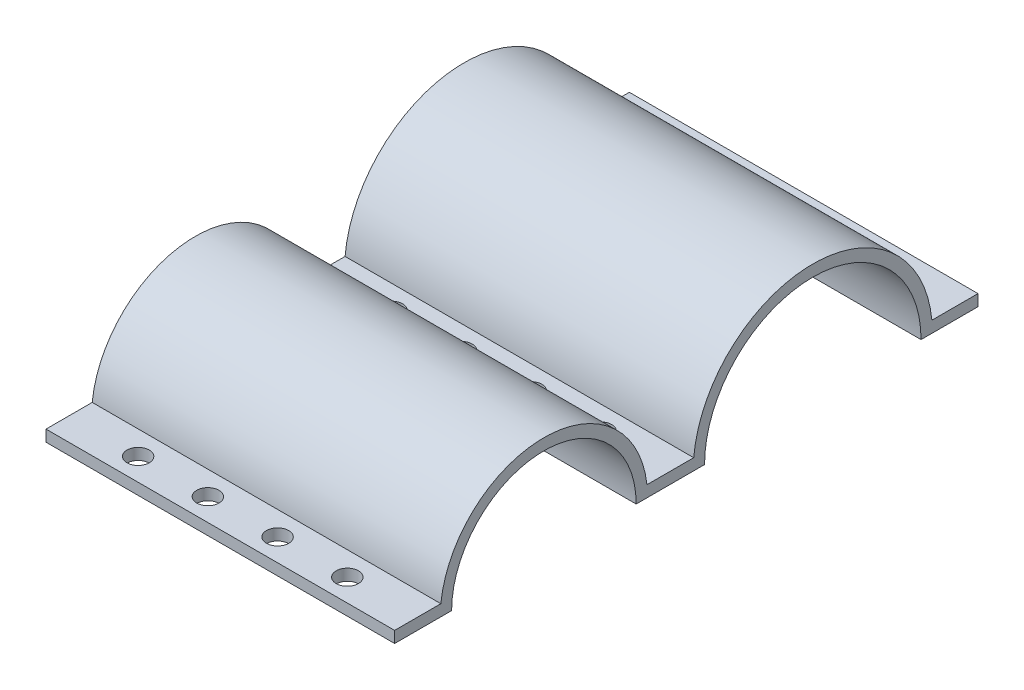
ISO-10303-21;
HEADER;
FILE_DESCRIPTION(('STEP AP214'),'2;1');
FILE_NAME('part.step','',(''),(''),'','','');
FILE_SCHEMA(('AUTOMOTIVE_DESIGN { 1 0 10303 214 1 1 1 1 }'));
ENDSEC;
DATA;
#1=APPLICATION_CONTEXT('core data for automotive mechanical design processes');
#2=APPLICATION_PROTOCOL_DEFINITION('international standard','automotive_design',2000,#1);
#3=PRODUCT_CONTEXT('',#1,'mechanical');
#4=PRODUCT('Part','Part','',(#3));
#5=PRODUCT_RELATED_PRODUCT_CATEGORY('part','',(#4));
#6=PRODUCT_DEFINITION_FORMATION('','',#4);
#7=PRODUCT_DEFINITION_CONTEXT('part definition',#1,'design');
#8=PRODUCT_DEFINITION('design','',#6,#7);
#9=PRODUCT_DEFINITION_SHAPE('','',#8);
#10=(LENGTH_UNIT() NAMED_UNIT(*) SI_UNIT(.MILLI.,.METRE.));
#11=(NAMED_UNIT(*) PLANE_ANGLE_UNIT() SI_UNIT($,.RADIAN.));
#12=(NAMED_UNIT(*) SI_UNIT($,.STERADIAN.) SOLID_ANGLE_UNIT());
#13=UNCERTAINTY_MEASURE_WITH_UNIT(LENGTH_MEASURE(1.E-05),#10,'distance_accuracy_value','');
#14=(GEOMETRIC_REPRESENTATION_CONTEXT(3) GLOBAL_UNCERTAINTY_ASSIGNED_CONTEXT((#13)) GLOBAL_UNIT_ASSIGNED_CONTEXT((#10,
#11,#12)) REPRESENTATION_CONTEXT('',''));
#15=CARTESIAN_POINT('',(0.,0.,0.));
#16=DIRECTION('',(0.,0.,1.));
#17=DIRECTION('',(1.,0.,0.));
#18=AXIS2_PLACEMENT_3D('',#15,#16,#17);
#19=CARTESIAN_POINT('',(61.2,2.,0.));
#20=DIRECTION('',(0.,0.,1.));
#21=DIRECTION('',(0.,-1.,0.));
#22=AXIS2_PLACEMENT_3D('',#19,#20,#21);
#23=PLANE('',#22);
#24=DIRECTION('',(0.,1.,0.));
#25=VECTOR('',#24,1.);
#26=CARTESIAN_POINT('',(0.,2.,0.));
#27=LINE('',#26,#25);
#28=CARTESIAN_POINT('',(0.,0.,0.));
#29=VERTEX_POINT('',#28);
#30=CARTESIAN_POINT('',(0.,2.,0.));
#31=VERTEX_POINT('',#30);
#32=EDGE_CURVE('E164',#29,#31,#27,.T.);
#33=ORIENTED_EDGE('',*,*,#32,.T.);
#34=DIRECTION('',(-1.,0.,0.));
#35=VECTOR('',#34,1.);
#36=CARTESIAN_POINT('',(61.2,2.,0.));
#37=LINE('',#36,#35);
#38=CARTESIAN_POINT('',(61.2,2.,0.));
#39=VERTEX_POINT('',#38);
#40=EDGE_CURVE('E11',#39,#31,#37,.T.);
#41=ORIENTED_EDGE('',*,*,#40,.F.);
#42=DIRECTION('',(0.,1.,0.));
#43=VECTOR('',#42,1.);
#44=CARTESIAN_POINT('',(61.2,2.,0.));
#45=LINE('',#44,#43);
#46=CARTESIAN_POINT('',(61.2,0.,0.));
#47=VERTEX_POINT('',#46);
#48=EDGE_CURVE('E199',#47,#39,#45,.T.);
#49=ORIENTED_EDGE('',*,*,#48,.F.);
#50=DIRECTION('',(-1.,0.,0.));
#51=VECTOR('',#50,1.);
#52=CARTESIAN_POINT('',(61.2,0.,0.));
#53=LINE('',#52,#51);
#54=EDGE_CURVE('E160',#47,#29,#53,.T.);
#55=ORIENTED_EDGE('',*,*,#54,.T.);
#56=EDGE_LOOP('',(#33,#41,#49,#55));
#57=FACE_BOUND('',#56,.T.);
#58=ADVANCED_FACE('F39',(#57),#23,.F.);
#59=CARTESIAN_POINT('',(61.2,2.,0.));
#60=DIRECTION('',(0.,-1.,0.));
#61=DIRECTION('',(0.,0.,-1.));
#62=AXIS2_PLACEMENT_3D('',#59,#60,#61);
#63=PLANE('',#62);
#64=CARTESIAN_POINT('',(24.48,2.,3.93000000000001));
#65=DIRECTION('',(0.,1.,0.));
#66=DIRECTION('',(0.,0.,1.));
#67=AXIS2_PLACEMENT_3D('',#64,#65,#66);
#68=CIRCLE('',#67,1.94999999999999);
#69=CARTESIAN_POINT('',(24.48,2.,5.88));
#70=VERTEX_POINT('',#69);
#71=EDGE_CURVE('E359',#70,#70,#68,.T.);
#72=ORIENTED_EDGE('',*,*,#71,.F.);
#73=EDGE_LOOP('',(#72));
#74=FACE_BOUND('',#73,.T.);
#75=CARTESIAN_POINT('',(36.72,2.,3.93000000000001));
#76=DIRECTION('',(0.,1.,0.));
#77=DIRECTION('',(0.,0.,1.));
#78=AXIS2_PLACEMENT_3D('',#75,#76,#77);
#79=CIRCLE('',#78,1.95);
#80=CARTESIAN_POINT('',(36.72,2.,5.88000000000001));
#81=VERTEX_POINT('',#80);
#82=EDGE_CURVE('E369',#81,#81,#79,.T.);
#83=ORIENTED_EDGE('',*,*,#82,.F.);
#84=EDGE_LOOP('',(#83));
#85=FACE_BOUND('',#84,.T.);
#86=CARTESIAN_POINT('',(48.96,2.,3.93));
#87=DIRECTION('',(0.,1.,0.));
#88=DIRECTION('',(0.,0.,1.));
#89=AXIS2_PLACEMENT_3D('',#86,#87,#88);
#90=CIRCLE('',#89,1.95);
#91=CARTESIAN_POINT('',(48.96,2.,5.88));
#92=VERTEX_POINT('',#91);
#93=EDGE_CURVE('E347',#92,#92,#90,.T.);
#94=ORIENTED_EDGE('',*,*,#93,.F.);
#95=EDGE_LOOP('',(#94));
#96=FACE_BOUND('',#95,.T.);
#97=CARTESIAN_POINT('',(12.24,2.,3.93000000000001));
#98=DIRECTION('',(0.,1.,0.));
#99=DIRECTION('',(0.,0.,1.));
#100=AXIS2_PLACEMENT_3D('',#97,#98,#99);
#101=CIRCLE('',#100,1.95);
#102=CARTESIAN_POINT('',(12.24,2.,5.88));
#103=VERTEX_POINT('',#102);
#104=EDGE_CURVE('E368',#103,#103,#101,.T.);
#105=ORIENTED_EDGE('',*,*,#104,.F.);
#106=EDGE_LOOP('',(#105));
#107=FACE_BOUND('',#106,.T.);
#108=DIRECTION('',(0.,0.,1.));
#109=VECTOR('',#108,1.);
#110=CARTESIAN_POINT('',(0.,2.,0.));
#111=LINE('',#110,#109);
#112=CARTESIAN_POINT('',(0.,2.,8.09545503963312));
#113=VERTEX_POINT('',#112);
#114=EDGE_CURVE('E168',#31,#113,#111,.T.);
#115=ORIENTED_EDGE('',*,*,#114,.T.);
#116=DIRECTION('',(-1.,0.,0.));
#117=VECTOR('',#116,1.);
#118=CARTESIAN_POINT('',(61.2,2.,8.09545503963312));
#119=LINE('',#118,#117);
#120=CARTESIAN_POINT('',(61.2,2.,8.09545503963312));
#121=VERTEX_POINT('',#120);
#122=EDGE_CURVE('E48',#121,#113,#119,.T.);
#123=ORIENTED_EDGE('',*,*,#122,.F.);
#124=DIRECTION('',(0.,0.,1.));
#125=VECTOR('',#124,1.);
#126=CARTESIAN_POINT('',(61.2,2.,0.));
#127=LINE('',#126,#125);
#128=EDGE_CURVE('E111',#39,#121,#127,.T.);
#129=ORIENTED_EDGE('',*,*,#128,.F.);
#130=ORIENTED_EDGE('',*,*,#40,.T.);
#131=EDGE_LOOP('',(#115,#123,#129,#130));
#132=FACE_BOUND('',#131,.T.);
#133=ADVANCED_FACE('F296',(#74,#85,#96,#107,#132),#63,.F.);
#134=CARTESIAN_POINT('',(61.2,0.,29.));
#135=DIRECTION('',(-1.,0.,0.));
#136=DIRECTION('',(0.,0.,1.));
#137=AXIS2_PLACEMENT_3D('',#134,#135,#136);
#138=CYLINDRICAL_SURFACE('',#137,21.);
#139=CARTESIAN_POINT('',(0.,0.,29.));
#140=DIRECTION('',(1.,0.,0.));
#141=DIRECTION('',(0.,0.,-1.));
#142=AXIS2_PLACEMENT_3D('',#139,#140,#141);
#143=CIRCLE('',#142,21.);
#144=CARTESIAN_POINT('',(0.,1.99999999999999,49.9045449603669));
#145=VERTEX_POINT('',#144);
#146=EDGE_CURVE('E172',#113,#145,#143,.T.);
#147=ORIENTED_EDGE('',*,*,#146,.T.);
#148=DIRECTION('',(-1.,0.,0.));
#149=VECTOR('',#148,1.);
#150=CARTESIAN_POINT('',(61.2,1.99999999999999,49.9045449603669));
#151=LINE('',#150,#149);
#152=CARTESIAN_POINT('',(61.2,1.99999999999999,49.9045449603669));
#153=VERTEX_POINT('',#152);
#154=EDGE_CURVE('E226',#153,#145,#151,.T.);
#155=ORIENTED_EDGE('',*,*,#154,.F.);
#156=CARTESIAN_POINT('',(61.2,0.,29.));
#157=DIRECTION('',(1.,0.,0.));
#158=DIRECTION('',(0.,0.,-1.));
#159=AXIS2_PLACEMENT_3D('',#156,#157,#158);
#160=CIRCLE('',#159,21.);
#161=EDGE_CURVE('E236',#121,#153,#160,.T.);
#162=ORIENTED_EDGE('',*,*,#161,.F.);
#163=ORIENTED_EDGE('',*,*,#122,.T.);
#164=EDGE_LOOP('',(#147,#155,#162,#163));
#165=FACE_BOUND('',#164,.T.);
#166=ADVANCED_FACE('F234',(#165),#138,.T.);
#167=CARTESIAN_POINT('',(61.2,1.99999999999999,49.9045449603669));
#168=DIRECTION('',(0.,-1.,0.));
#169=DIRECTION('',(0.,0.,-1.));
#170=AXIS2_PLACEMENT_3D('',#167,#168,#169);
#171=PLANE('',#170);
#172=CARTESIAN_POINT('',(24.48,2.,54.0073844211746));
#173=DIRECTION('',(0.,1.,0.));
#174=DIRECTION('',(0.,0.,1.));
#175=AXIS2_PLACEMENT_3D('',#172,#173,#174);
#176=CIRCLE('',#175,1.95);
#177=CARTESIAN_POINT('',(24.48,2.,55.9573844211746));
#178=VERTEX_POINT('',#177);
#179=EDGE_CURVE('E393',#178,#178,#176,.T.);
#180=ORIENTED_EDGE('',*,*,#179,.F.);
#181=EDGE_LOOP('',(#180));
#182=FACE_BOUND('',#181,.T.);
#183=CARTESIAN_POINT('',(36.72,2.,54.0073844211746));
#184=DIRECTION('',(0.,1.,0.));
#185=DIRECTION('',(0.,0.,1.));
#186=AXIS2_PLACEMENT_3D('',#183,#184,#185);
#187=CIRCLE('',#186,1.95);
#188=CARTESIAN_POINT('',(36.72,2.,55.9573844211746));
#189=VERTEX_POINT('',#188);
#190=EDGE_CURVE('E394',#189,#189,#187,.T.);
#191=ORIENTED_EDGE('',*,*,#190,.F.);
#192=EDGE_LOOP('',(#191));
#193=FACE_BOUND('',#192,.T.);
#194=CARTESIAN_POINT('',(48.96,2.,54.0073844211746));
#195=DIRECTION('',(0.,1.,0.));
#196=DIRECTION('',(0.,0.,1.));
#197=AXIS2_PLACEMENT_3D('',#194,#195,#196);
#198=CIRCLE('',#197,1.95);
#199=CARTESIAN_POINT('',(48.96,2.,55.9573844211746));
#200=VERTEX_POINT('',#199);
#201=EDGE_CURVE('E407',#200,#200,#198,.T.);
#202=ORIENTED_EDGE('',*,*,#201,.F.);
#203=EDGE_LOOP('',(#202));
#204=FACE_BOUND('',#203,.T.);
#205=CARTESIAN_POINT('',(12.24,2.,54.0073844211746));
#206=DIRECTION('',(0.,1.,0.));
#207=DIRECTION('',(0.,0.,1.));
#208=AXIS2_PLACEMENT_3D('',#205,#206,#207);
#209=CIRCLE('',#208,1.95);
#210=CARTESIAN_POINT('',(12.24,2.,55.9573844211746));
#211=VERTEX_POINT('',#210);
#212=EDGE_CURVE('E348',#211,#211,#209,.T.);
#213=ORIENTED_EDGE('',*,*,#212,.F.);
#214=EDGE_LOOP('',(#213));
#215=FACE_BOUND('',#214,.T.);
#216=DIRECTION('',(0.,0.,1.));
#217=VECTOR('',#216,1.);
#218=CARTESIAN_POINT('',(0.,1.99999999999999,49.9045449603669));
#219=LINE('',#218,#217);
#220=CARTESIAN_POINT('',(0.,1.99999999999999,58.1102238819823));
#221=VERTEX_POINT('',#220);
#222=EDGE_CURVE('E175',#145,#221,#219,.T.);
#223=ORIENTED_EDGE('',*,*,#222,.T.);
#224=DIRECTION('',(-1.,0.,0.));
#225=VECTOR('',#224,1.);
#226=CARTESIAN_POINT('',(61.2,1.99999999999999,58.1102238819823));
#227=LINE('',#226,#225);
#228=CARTESIAN_POINT('',(61.2,1.99999999999999,58.1102238819823));
#229=VERTEX_POINT('',#228);
#230=EDGE_CURVE('E222',#229,#221,#227,.T.);
#231=ORIENTED_EDGE('',*,*,#230,.F.);
#232=DIRECTION('',(0.,0.,1.));
#233=VECTOR('',#232,1.);
#234=CARTESIAN_POINT('',(61.2,1.99999999999999,49.9045449603669));
#235=LINE('',#234,#233);
#236=EDGE_CURVE('E255',#153,#229,#235,.T.);
#237=ORIENTED_EDGE('',*,*,#236,.F.);
#238=ORIENTED_EDGE('',*,*,#154,.T.);
#239=EDGE_LOOP('',(#223,#231,#237,#238));
#240=FACE_BOUND('',#239,.T.);
#241=ADVANCED_FACE('F245',(#182,#193,#204,#215,#240),#171,.F.);
#242=CARTESIAN_POINT('',(61.2,0.,76.1999999999999));
#243=DIRECTION('',(-1.,0.,0.));
#244=DIRECTION('',(0.,0.,1.));
#245=AXIS2_PLACEMENT_3D('',#242,#243,#244);
#246=CYLINDRICAL_SURFACE('',#245,18.2);
#247=CARTESIAN_POINT('',(0.,0.,76.1999999999999));
#248=DIRECTION('',(1.,0.,0.));
#249=DIRECTION('',(0.,0.,-1.));
#250=AXIS2_PLACEMENT_3D('',#247,#248,#249);
#251=CIRCLE('',#250,18.2);
#252=CARTESIAN_POINT('',(0.,1.99999999999999,94.2897761180175));
#253=VERTEX_POINT('',#252);
#254=EDGE_CURVE('E178',#221,#253,#251,.T.);
#255=ORIENTED_EDGE('',*,*,#254,.T.);
#256=DIRECTION('',(-1.,0.,0.));
#257=VECTOR('',#256,1.);
#258=CARTESIAN_POINT('',(61.2,1.99999999999999,94.2897761180175));
#259=LINE('',#258,#257);
#260=CARTESIAN_POINT('',(61.2,1.99999999999999,94.2897761180175));
#261=VERTEX_POINT('',#260);
#262=EDGE_CURVE('E218',#261,#253,#259,.T.);
#263=ORIENTED_EDGE('',*,*,#262,.F.);
#264=CARTESIAN_POINT('',(61.2,0.,76.1999999999999));
#265=DIRECTION('',(1.,0.,0.));
#266=DIRECTION('',(0.,0.,-1.));
#267=AXIS2_PLACEMENT_3D('',#264,#265,#266);
#268=CIRCLE('',#267,18.2);
#269=EDGE_CURVE('E251',#229,#261,#268,.T.);
#270=ORIENTED_EDGE('',*,*,#269,.F.);
#271=ORIENTED_EDGE('',*,*,#230,.T.);
#272=EDGE_LOOP('',(#255,#263,#270,#271));
#273=FACE_BOUND('',#272,.T.);
#274=ADVANCED_FACE('F249',(#273),#246,.T.);
#275=CARTESIAN_POINT('',(61.2,1.99999999999999,94.2897761180175));
#276=DIRECTION('',(0.,-1.,0.));
#277=DIRECTION('',(0.,0.,-1.));
#278=AXIS2_PLACEMENT_3D('',#275,#276,#277);
#279=PLANE('',#278);
#280=CARTESIAN_POINT('',(12.24,2.,98.4699999999999));
#281=DIRECTION('',(0.,1.,0.));
#282=DIRECTION('',(0.,0.,1.));
#283=AXIS2_PLACEMENT_3D('',#280,#281,#282);
#284=CIRCLE('',#283,1.95000000000001);
#285=CARTESIAN_POINT('',(12.24,2.,100.42));
#286=VERTEX_POINT('',#285);
#287=EDGE_CURVE('E408',#286,#286,#284,.T.);
#288=ORIENTED_EDGE('',*,*,#287,.F.);
#289=EDGE_LOOP('',(#288));
#290=FACE_BOUND('',#289,.T.);
#291=CARTESIAN_POINT('',(24.48,2.,98.4699999999999));
#292=DIRECTION('',(0.,1.,0.));
#293=DIRECTION('',(0.,0.,1.));
#294=AXIS2_PLACEMENT_3D('',#291,#292,#293);
#295=CIRCLE('',#294,1.94999999999999);
#296=CARTESIAN_POINT('',(24.48,2.,100.42));
#297=VERTEX_POINT('',#296);
#298=EDGE_CURVE('E431',#297,#297,#295,.T.);
#299=ORIENTED_EDGE('',*,*,#298,.F.);
#300=EDGE_LOOP('',(#299));
#301=FACE_BOUND('',#300,.T.);
#302=CARTESIAN_POINT('',(36.72,2.,98.4699999999999));
#303=DIRECTION('',(0.,1.,0.));
#304=DIRECTION('',(0.,0.,1.));
#305=AXIS2_PLACEMENT_3D('',#302,#303,#304);
#306=CIRCLE('',#305,1.94999999999999);
#307=CARTESIAN_POINT('',(36.72,2.,100.42));
#308=VERTEX_POINT('',#307);
#309=EDGE_CURVE('E422',#308,#308,#306,.T.);
#310=ORIENTED_EDGE('',*,*,#309,.F.);
#311=EDGE_LOOP('',(#310));
#312=FACE_BOUND('',#311,.T.);
#313=CARTESIAN_POINT('',(48.96,2.,98.4699999999999));
#314=DIRECTION('',(0.,1.,0.));
#315=DIRECTION('',(0.,0.,1.));
#316=AXIS2_PLACEMENT_3D('',#313,#314,#315);
#317=CIRCLE('',#316,1.94999999999999);
#318=CARTESIAN_POINT('',(48.96,2.,100.42));
#319=VERTEX_POINT('',#318);
#320=EDGE_CURVE('E423',#319,#319,#317,.T.);
#321=ORIENTED_EDGE('',*,*,#320,.F.);
#322=EDGE_LOOP('',(#321));
#323=FACE_BOUND('',#322,.T.);
#324=DIRECTION('',(0.,0.,1.));
#325=VECTOR('',#324,1.);
#326=CARTESIAN_POINT('',(0.,1.99999999999999,94.2897761180175));
#327=LINE('',#326,#325);
#328=CARTESIAN_POINT('',(0.,1.99999999999999,102.4));
#329=VERTEX_POINT('',#328);
#330=EDGE_CURVE('E181',#253,#329,#327,.T.);
#331=ORIENTED_EDGE('',*,*,#330,.T.);
#332=DIRECTION('',(-1.,0.,0.));
#333=VECTOR('',#332,1.);
#334=CARTESIAN_POINT('',(61.2,1.99999999999999,102.4));
#335=LINE('',#334,#333);
#336=CARTESIAN_POINT('',(61.2,1.99999999999999,102.4));
#337=VERTEX_POINT('',#336);
#338=EDGE_CURVE('E214',#337,#329,#335,.T.);
#339=ORIENTED_EDGE('',*,*,#338,.F.);
#340=DIRECTION('',(0.,0.,1.));
#341=VECTOR('',#340,1.);
#342=CARTESIAN_POINT('',(61.2,1.99999999999999,94.2897761180175));
#343=LINE('',#342,#341);
#344=EDGE_CURVE('E254',#261,#337,#343,.T.);
#345=ORIENTED_EDGE('',*,*,#344,.F.);
#346=ORIENTED_EDGE('',*,*,#262,.T.);
#347=EDGE_LOOP('',(#331,#339,#345,#346));
#348=FACE_BOUND('',#347,.T.);
#349=ADVANCED_FACE('F313',(#290,#301,#312,#323,#348),#279,.F.);
#350=CARTESIAN_POINT('',(61.2,0.,102.4));
#351=DIRECTION('',(0.,0.,-1.));
#352=DIRECTION('',(-1.,0.,0.));
#353=AXIS2_PLACEMENT_3D('',#350,#351,#352);
#354=PLANE('',#353);
#355=DIRECTION('',(0.,-1.,0.));
#356=VECTOR('',#355,1.);
#357=CARTESIAN_POINT('',(0.,0.,102.4));
#358=LINE('',#357,#356);
#359=CARTESIAN_POINT('',(0.,0.,102.4));
#360=VERTEX_POINT('',#359);
#361=EDGE_CURVE('E184',#329,#360,#358,.T.);
#362=ORIENTED_EDGE('',*,*,#361,.T.);
#363=DIRECTION('',(-1.,0.,0.));
#364=VECTOR('',#363,1.);
#365=CARTESIAN_POINT('',(61.2,0.,102.4));
#366=LINE('',#365,#364);
#367=CARTESIAN_POINT('',(61.2,0.,102.4));
#368=VERTEX_POINT('',#367);
#369=EDGE_CURVE('E210',#368,#360,#366,.T.);
#370=ORIENTED_EDGE('',*,*,#369,.F.);
#371=DIRECTION('',(0.,-1.,0.));
#372=VECTOR('',#371,1.);
#373=CARTESIAN_POINT('',(61.2,0.,102.4));
#374=LINE('',#373,#372);
#375=EDGE_CURVE('E259',#337,#368,#374,.T.);
#376=ORIENTED_EDGE('',*,*,#375,.F.);
#377=ORIENTED_EDGE('',*,*,#338,.T.);
#378=EDGE_LOOP('',(#362,#370,#376,#377));
#379=FACE_BOUND('',#378,.T.);
#380=ADVANCED_FACE('F316',(#379),#354,.F.);
#381=CARTESIAN_POINT('',(61.2,0.,92.3999999999999));
#382=DIRECTION('',(0.,1.,0.));
#383=DIRECTION('',(0.,0.,1.));
#384=AXIS2_PLACEMENT_3D('',#381,#382,#383);
#385=PLANE('',#384);
#386=CARTESIAN_POINT('',(12.24,0.,98.4699999999999));
#387=DIRECTION('',(0.,1.,0.));
#388=DIRECTION('',(0.,0.,1.));
#389=AXIS2_PLACEMENT_3D('',#386,#387,#388);
#390=CIRCLE('',#389,1.95000000000001);
#391=CARTESIAN_POINT('',(12.24,0.,100.42));
#392=VERTEX_POINT('',#391);
#393=EDGE_CURVE('E403',#392,#392,#390,.F.);
#394=ORIENTED_EDGE('',*,*,#393,.F.);
#395=EDGE_LOOP('',(#394));
#396=FACE_BOUND('',#395,.T.);
#397=CARTESIAN_POINT('',(24.48,0.,98.4699999999999));
#398=DIRECTION('',(0.,1.,0.));
#399=DIRECTION('',(0.,0.,1.));
#400=AXIS2_PLACEMENT_3D('',#397,#398,#399);
#401=CIRCLE('',#400,1.94999999999999);
#402=CARTESIAN_POINT('',(24.48,0.,100.42));
#403=VERTEX_POINT('',#402);
#404=EDGE_CURVE('E412',#403,#403,#401,.F.);
#405=ORIENTED_EDGE('',*,*,#404,.F.);
#406=EDGE_LOOP('',(#405));
#407=FACE_BOUND('',#406,.T.);
#408=CARTESIAN_POINT('',(36.72,0.,98.4699999999999));
#409=DIRECTION('',(0.,1.,0.));
#410=DIRECTION('',(0.,0.,1.));
#411=AXIS2_PLACEMENT_3D('',#408,#409,#410);
#412=CIRCLE('',#411,1.94999999999999);
#413=CARTESIAN_POINT('',(36.72,0.,100.42));
#414=VERTEX_POINT('',#413);
#415=EDGE_CURVE('E427',#414,#414,#412,.F.);
#416=ORIENTED_EDGE('',*,*,#415,.F.);
#417=EDGE_LOOP('',(#416));
#418=FACE_BOUND('',#417,.T.);
#419=CARTESIAN_POINT('',(48.96,0.,98.4699999999999));
#420=DIRECTION('',(0.,1.,0.));
#421=DIRECTION('',(0.,0.,1.));
#422=AXIS2_PLACEMENT_3D('',#419,#420,#421);
#423=CIRCLE('',#422,1.94999999999999);
#424=CARTESIAN_POINT('',(48.96,0.,100.42));
#425=VERTEX_POINT('',#424);
#426=EDGE_CURVE('E418',#425,#425,#423,.F.);
#427=ORIENTED_EDGE('',*,*,#426,.F.);
#428=EDGE_LOOP('',(#427));
#429=FACE_BOUND('',#428,.T.);
#430=DIRECTION('',(0.,0.,-1.));
#431=VECTOR('',#430,1.);
#432=CARTESIAN_POINT('',(0.,0.,92.3999999999999));
#433=LINE('',#432,#431);
#434=CARTESIAN_POINT('',(0.,0.,92.3999999999999));
#435=VERTEX_POINT('',#434);
#436=EDGE_CURVE('E187',#360,#435,#433,.T.);
#437=ORIENTED_EDGE('',*,*,#436,.T.);
#438=DIRECTION('',(-1.,0.,0.));
#439=VECTOR('',#438,1.);
#440=CARTESIAN_POINT('',(61.2,0.,92.3999999999999));
#441=LINE('',#440,#439);
#442=CARTESIAN_POINT('',(61.2,0.,92.3999999999999));
#443=VERTEX_POINT('',#442);
#444=EDGE_CURVE('E206',#443,#435,#441,.T.);
#445=ORIENTED_EDGE('',*,*,#444,.F.);
#446=DIRECTION('',(0.,0.,-1.));
#447=VECTOR('',#446,1.);
#448=CARTESIAN_POINT('',(61.2,0.,92.3999999999999));
#449=LINE('',#448,#447);
#450=EDGE_CURVE('E266',#368,#443,#449,.T.);
#451=ORIENTED_EDGE('',*,*,#450,.F.);
#452=ORIENTED_EDGE('',*,*,#369,.T.);
#453=EDGE_LOOP('',(#437,#445,#451,#452));
#454=FACE_BOUND('',#453,.T.);
#455=ADVANCED_FACE('F274',(#396,#407,#418,#429,#454),#385,.F.);
#456=CARTESIAN_POINT('',(61.2,0.,76.1999999999999));
#457=DIRECTION('',(-1.,0.,0.));
#458=DIRECTION('',(0.,0.,1.));
#459=AXIS2_PLACEMENT_3D('',#456,#457,#458);
#460=CYLINDRICAL_SURFACE('',#459,16.2);
#461=CARTESIAN_POINT('',(0.,0.,76.1999999999999));
#462=DIRECTION('',(-1.,0.,0.));
#463=DIRECTION('',(0.,0.,-1.));
#464=AXIS2_PLACEMENT_3D('',#461,#462,#463);
#465=CIRCLE('',#464,16.2);
#466=CARTESIAN_POINT('',(0.,0.,59.9999999999999));
#467=VERTEX_POINT('',#466);
#468=EDGE_CURVE('E190',#435,#467,#465,.T.);
#469=ORIENTED_EDGE('',*,*,#468,.T.);
#470=DIRECTION('',(-1.,0.,0.));
#471=VECTOR('',#470,1.);
#472=CARTESIAN_POINT('',(61.2,0.,59.9999999999999));
#473=LINE('',#472,#471);
#474=CARTESIAN_POINT('',(61.2,0.,59.9999999999999));
#475=VERTEX_POINT('',#474);
#476=EDGE_CURVE('E153',#475,#467,#473,.T.);
#477=ORIENTED_EDGE('',*,*,#476,.F.);
#478=CARTESIAN_POINT('',(61.2,0.,76.1999999999999));
#479=DIRECTION('',(-1.,0.,0.));
#480=DIRECTION('',(0.,0.,-1.));
#481=AXIS2_PLACEMENT_3D('',#478,#479,#480);
#482=CIRCLE('',#481,16.2);
#483=EDGE_CURVE('E142',#443,#475,#482,.T.);
#484=ORIENTED_EDGE('',*,*,#483,.F.);
#485=ORIENTED_EDGE('',*,*,#444,.T.);
#486=EDGE_LOOP('',(#469,#477,#484,#485));
#487=FACE_BOUND('',#486,.T.);
#488=ADVANCED_FACE('F278',(#487),#460,.F.);
#489=CARTESIAN_POINT('',(61.2,0.,48.));
#490=DIRECTION('',(0.,1.,0.));
#491=DIRECTION('',(0.,0.,1.));
#492=AXIS2_PLACEMENT_3D('',#489,#490,#491);
#493=PLANE('',#492);
#494=CARTESIAN_POINT('',(24.48,3.84241249928863E-13,54.0073844211746));
#495=DIRECTION('',(0.,1.,0.));
#496=DIRECTION('',(0.,0.,1.));
#497=AXIS2_PLACEMENT_3D('',#494,#495,#496);
#498=CIRCLE('',#497,1.95);
#499=CARTESIAN_POINT('',(24.48,3.68265032087706E-13,55.9573844211746));
#500=VERTEX_POINT('',#499);
#501=EDGE_CURVE('E333',#500,#500,#498,.F.);
#502=ORIENTED_EDGE('',*,*,#501,.F.);
#503=EDGE_LOOP('',(#502));
#504=FACE_BOUND('',#503,.T.);
#505=CARTESIAN_POINT('',(36.72,3.84241249928863E-13,54.0073844211746));
#506=DIRECTION('',(0.,1.,0.));
#507=DIRECTION('',(0.,0.,1.));
#508=AXIS2_PLACEMENT_3D('',#505,#506,#507);
#509=CIRCLE('',#508,1.95);
#510=CARTESIAN_POINT('',(36.72,3.68265032087706E-13,55.9573844211746));
#511=VERTEX_POINT('',#510);
#512=EDGE_CURVE('E337',#511,#511,#509,.F.);
#513=ORIENTED_EDGE('',*,*,#512,.F.);
#514=EDGE_LOOP('',(#513));
#515=FACE_BOUND('',#514,.T.);
#516=CARTESIAN_POINT('',(48.96,3.84241249928863E-13,54.0073844211746));
#517=DIRECTION('',(0.,1.,0.));
#518=DIRECTION('',(0.,0.,1.));
#519=AXIS2_PLACEMENT_3D('',#516,#517,#518);
#520=CIRCLE('',#519,1.95);
#521=CARTESIAN_POINT('',(48.96,3.68265032087706E-13,55.9573844211746));
#522=VERTEX_POINT('',#521);
#523=EDGE_CURVE('E341',#522,#522,#520,.F.);
#524=ORIENTED_EDGE('',*,*,#523,.F.);
#525=EDGE_LOOP('',(#524));
#526=FACE_BOUND('',#525,.T.);
#527=CARTESIAN_POINT('',(12.24,3.84241249928863E-13,54.0073844211746));
#528=DIRECTION('',(0.,1.,0.));
#529=DIRECTION('',(0.,0.,1.));
#530=AXIS2_PLACEMENT_3D('',#527,#528,#529);
#531=CIRCLE('',#530,1.95);
#532=CARTESIAN_POINT('',(12.24,3.68265032087706E-13,55.9573844211746));
#533=VERTEX_POINT('',#532);
#534=EDGE_CURVE('E344',#533,#533,#531,.F.);
#535=ORIENTED_EDGE('',*,*,#534,.F.);
#536=EDGE_LOOP('',(#535));
#537=FACE_BOUND('',#536,.T.);
#538=DIRECTION('',(0.,0.,-1.));
#539=VECTOR('',#538,1.);
#540=CARTESIAN_POINT('',(0.,0.,48.));
#541=LINE('',#540,#539);
#542=CARTESIAN_POINT('',(0.,0.,48.));
#543=VERTEX_POINT('',#542);
#544=EDGE_CURVE('E151',#467,#543,#541,.T.);
#545=ORIENTED_EDGE('',*,*,#544,.T.);
#546=DIRECTION('',(-1.,0.,0.));
#547=VECTOR('',#546,1.);
#548=CARTESIAN_POINT('',(61.2,0.,48.));
#549=LINE('',#548,#547);
#550=CARTESIAN_POINT('',(61.2,0.,48.));
#551=VERTEX_POINT('',#550);
#552=EDGE_CURVE('E148',#551,#543,#549,.T.);
#553=ORIENTED_EDGE('',*,*,#552,.F.);
#554=DIRECTION('',(0.,0.,-1.));
#555=VECTOR('',#554,1.);
#556=CARTESIAN_POINT('',(61.2,0.,48.));
#557=LINE('',#556,#555);
#558=EDGE_CURVE('E136',#475,#551,#557,.T.);
#559=ORIENTED_EDGE('',*,*,#558,.F.);
#560=ORIENTED_EDGE('',*,*,#476,.T.);
#561=EDGE_LOOP('',(#545,#553,#559,#560));
#562=FACE_BOUND('',#561,.T.);
#563=ADVANCED_FACE('F149',(#504,#515,#526,#537,#562),#493,.F.);
#564=CARTESIAN_POINT('',(61.2,0.,29.));
#565=DIRECTION('',(-1.,0.,0.));
#566=DIRECTION('',(0.,0.,1.));
#567=AXIS2_PLACEMENT_3D('',#564,#565,#566);
#568=CYLINDRICAL_SURFACE('',#567,19.);
#569=CARTESIAN_POINT('',(0.,0.,29.));
#570=DIRECTION('',(-1.,0.,0.));
#571=DIRECTION('',(0.,0.,-1.));
#572=AXIS2_PLACEMENT_3D('',#569,#570,#571);
#573=CIRCLE('',#572,19.);
#574=CARTESIAN_POINT('',(0.,0.,9.99999999999999));
#575=VERTEX_POINT('',#574);
#576=EDGE_CURVE('E97',#543,#575,#573,.T.);
#577=ORIENTED_EDGE('',*,*,#576,.T.);
#578=DIRECTION('',(-1.,0.,0.));
#579=VECTOR('',#578,1.);
#580=CARTESIAN_POINT('',(61.2,0.,9.99999999999999));
#581=LINE('',#580,#579);
#582=CARTESIAN_POINT('',(61.2,0.,9.99999999999999));
#583=VERTEX_POINT('',#582);
#584=EDGE_CURVE('E154',#583,#575,#581,.T.);
#585=ORIENTED_EDGE('',*,*,#584,.F.);
#586=CARTESIAN_POINT('',(61.2,0.,29.));
#587=DIRECTION('',(-1.,0.,0.));
#588=DIRECTION('',(0.,0.,-1.));
#589=AXIS2_PLACEMENT_3D('',#586,#587,#588);
#590=CIRCLE('',#589,19.);
#591=EDGE_CURVE('E140',#551,#583,#590,.T.);
#592=ORIENTED_EDGE('',*,*,#591,.F.);
#593=ORIENTED_EDGE('',*,*,#552,.T.);
#594=EDGE_LOOP('',(#577,#585,#592,#593));
#595=FACE_BOUND('',#594,.T.);
#596=ADVANCED_FACE('F156',(#595),#568,.F.);
#597=CARTESIAN_POINT('',(61.2,0.,0.));
#598=DIRECTION('',(0.,1.,0.));
#599=DIRECTION('',(0.,0.,1.));
#600=AXIS2_PLACEMENT_3D('',#597,#598,#599);
#601=PLANE('',#600);
#602=CARTESIAN_POINT('',(24.48,7.94503351997378E-13,3.93000000000001));
#603=DIRECTION('',(0.,1.,0.));
#604=DIRECTION('',(0.,0.,1.));
#605=AXIS2_PLACEMENT_3D('',#602,#603,#604);
#606=CIRCLE('',#605,1.94999999999999);
#607=CARTESIAN_POINT('',(24.48,7.78527134156221E-13,5.88));
#608=VERTEX_POINT('',#607);
#609=EDGE_CURVE('E363',#608,#608,#606,.F.);
#610=ORIENTED_EDGE('',*,*,#609,.F.);
#611=EDGE_LOOP('',(#610));
#612=FACE_BOUND('',#611,.T.);
#613=CARTESIAN_POINT('',(36.72,7.94503351997378E-13,3.93000000000001));
#614=DIRECTION('',(0.,1.,0.));
#615=DIRECTION('',(0.,0.,1.));
#616=AXIS2_PLACEMENT_3D('',#613,#614,#615);
#617=CIRCLE('',#616,1.95);
#618=CARTESIAN_POINT('',(36.72,7.78527134156221E-13,5.88000000000001));
#619=VERTEX_POINT('',#618);
#620=EDGE_CURVE('E364',#619,#619,#617,.F.);
#621=ORIENTED_EDGE('',*,*,#620,.F.);
#622=EDGE_LOOP('',(#621));
#623=FACE_BOUND('',#622,.T.);
#624=CARTESIAN_POINT('',(48.96,7.94503351997378E-13,3.93));
#625=DIRECTION('',(0.,1.,0.));
#626=DIRECTION('',(0.,0.,1.));
#627=AXIS2_PLACEMENT_3D('',#624,#625,#626);
#628=CIRCLE('',#627,1.95);
#629=CARTESIAN_POINT('',(48.96,7.78527134156221E-13,5.88));
#630=VERTEX_POINT('',#629);
#631=EDGE_CURVE('E353',#630,#630,#628,.F.);
#632=ORIENTED_EDGE('',*,*,#631,.F.);
#633=EDGE_LOOP('',(#632));
#634=FACE_BOUND('',#633,.T.);
#635=CARTESIAN_POINT('',(12.24,7.94503351997378E-13,3.93000000000001));
#636=DIRECTION('',(0.,1.,0.));
#637=DIRECTION('',(0.,0.,1.));
#638=AXIS2_PLACEMENT_3D('',#635,#636,#637);
#639=CIRCLE('',#638,1.95);
#640=CARTESIAN_POINT('',(12.24,7.78527134156221E-13,5.88));
#641=VERTEX_POINT('',#640);
#642=EDGE_CURVE('E169',#641,#641,#639,.F.);
#643=ORIENTED_EDGE('',*,*,#642,.F.);
#644=EDGE_LOOP('',(#643));
#645=FACE_BOUND('',#644,.T.);
#646=DIRECTION('',(0.,0.,-1.));
#647=VECTOR('',#646,1.);
#648=CARTESIAN_POINT('',(0.,0.,0.));
#649=LINE('',#648,#647);
#650=EDGE_CURVE('E103',#575,#29,#649,.T.);
#651=ORIENTED_EDGE('',*,*,#650,.T.);
#652=ORIENTED_EDGE('',*,*,#54,.F.);
#653=DIRECTION('',(0.,0.,-1.));
#654=VECTOR('',#653,1.);
#655=CARTESIAN_POINT('',(61.2,0.,0.));
#656=LINE('',#655,#654);
#657=EDGE_CURVE('E56',#583,#47,#656,.T.);
#658=ORIENTED_EDGE('',*,*,#657,.F.);
#659=ORIENTED_EDGE('',*,*,#584,.T.);
#660=EDGE_LOOP('',(#651,#652,#658,#659));
#661=FACE_BOUND('',#660,.T.);
#662=ADVANCED_FACE('F282',(#612,#623,#634,#645,#661),#601,.F.);
#663=CARTESIAN_POINT('',(61.2,0.,29.));
#664=DIRECTION('',(1.,0.,0.));
#665=DIRECTION('',(0.,0.,-1.));
#666=AXIS2_PLACEMENT_3D('',#663,#664,#665);
#667=PLANE('',#666);
#668=ORIENTED_EDGE('',*,*,#48,.T.);
#669=ORIENTED_EDGE('',*,*,#128,.T.);
#670=ORIENTED_EDGE('',*,*,#161,.T.);
#671=ORIENTED_EDGE('',*,*,#236,.T.);
#672=ORIENTED_EDGE('',*,*,#269,.T.);
#673=ORIENTED_EDGE('',*,*,#344,.T.);
#674=ORIENTED_EDGE('',*,*,#375,.T.);
#675=ORIENTED_EDGE('',*,*,#450,.T.);
#676=ORIENTED_EDGE('',*,*,#483,.T.);
#677=ORIENTED_EDGE('',*,*,#558,.T.);
#678=ORIENTED_EDGE('',*,*,#591,.T.);
#679=ORIENTED_EDGE('',*,*,#657,.T.);
#680=EDGE_LOOP('',(#668,#669,#670,#671,#672,#673,#674,#675,#676,#677,#678,#679));
#681=FACE_BOUND('',#680,.T.);
#682=ADVANCED_FACE('F138',(#681),#667,.T.);
#683=CARTESIAN_POINT('',(0.,0.,29.));
#684=DIRECTION('',(1.,0.,0.));
#685=DIRECTION('',(0.,0.,-1.));
#686=AXIS2_PLACEMENT_3D('',#683,#684,#685);
#687=PLANE('',#686);
#688=ORIENTED_EDGE('',*,*,#32,.F.);
#689=ORIENTED_EDGE('',*,*,#650,.F.);
#690=ORIENTED_EDGE('',*,*,#576,.F.);
#691=ORIENTED_EDGE('',*,*,#544,.F.);
#692=ORIENTED_EDGE('',*,*,#468,.F.);
#693=ORIENTED_EDGE('',*,*,#436,.F.);
#694=ORIENTED_EDGE('',*,*,#361,.F.);
#695=ORIENTED_EDGE('',*,*,#330,.F.);
#696=ORIENTED_EDGE('',*,*,#254,.F.);
#697=ORIENTED_EDGE('',*,*,#222,.F.);
#698=ORIENTED_EDGE('',*,*,#146,.F.);
#699=ORIENTED_EDGE('',*,*,#114,.F.);
#700=EDGE_LOOP('',(#688,#689,#690,#691,#692,#693,#694,#695,#696,#697,#698,#699));
#701=FACE_BOUND('',#700,.T.);
#702=ADVANCED_FACE('F240',(#701),#687,.F.);
#703=CARTESIAN_POINT('',(12.24,-5.51543289325507,3.93000000000001));
#704=DIRECTION('',(0.,1.,0.));
#705=DIRECTION('',(0.,0.,1.));
#706=AXIS2_PLACEMENT_3D('',#703,#704,#705);
#707=CYLINDRICAL_SURFACE('',#706,1.95);
#708=ORIENTED_EDGE('',*,*,#642,.T.);
#709=EDGE_LOOP('',(#708));
#710=FACE_BOUND('',#709,.T.);
#711=ORIENTED_EDGE('',*,*,#104,.T.);
#712=EDGE_LOOP('',(#711));
#713=FACE_BOUND('',#712,.T.);
#714=ADVANCED_FACE('F485',(#710,#713),#707,.F.);
#715=CARTESIAN_POINT('',(48.96,-5.51543289325507,3.93));
#716=DIRECTION('',(0.,1.,0.));
#717=DIRECTION('',(0.,0.,1.));
#718=AXIS2_PLACEMENT_3D('',#715,#716,#717);
#719=CYLINDRICAL_SURFACE('',#718,1.95);
#720=ORIENTED_EDGE('',*,*,#631,.T.);
#721=EDGE_LOOP('',(#720));
#722=FACE_BOUND('',#721,.T.);
#723=ORIENTED_EDGE('',*,*,#93,.T.);
#724=EDGE_LOOP('',(#723));
#725=FACE_BOUND('',#724,.T.);
#726=ADVANCED_FACE('F481',(#722,#725),#719,.F.);
#727=CARTESIAN_POINT('',(36.72,-5.51543289325507,3.93000000000001));
#728=DIRECTION('',(0.,1.,0.));
#729=DIRECTION('',(0.,0.,1.));
#730=AXIS2_PLACEMENT_3D('',#727,#728,#729);
#731=CYLINDRICAL_SURFACE('',#730,1.95);
#732=ORIENTED_EDGE('',*,*,#620,.T.);
#733=EDGE_LOOP('',(#732));
#734=FACE_BOUND('',#733,.T.);
#735=ORIENTED_EDGE('',*,*,#82,.T.);
#736=EDGE_LOOP('',(#735));
#737=FACE_BOUND('',#736,.T.);
#738=ADVANCED_FACE('F484',(#734,#737),#731,.F.);
#739=CARTESIAN_POINT('',(24.48,-5.51543289325507,3.93000000000001));
#740=DIRECTION('',(0.,1.,0.));
#741=DIRECTION('',(0.,0.,1.));
#742=AXIS2_PLACEMENT_3D('',#739,#740,#741);
#743=CYLINDRICAL_SURFACE('',#742,1.94999999999999);
#744=ORIENTED_EDGE('',*,*,#609,.T.);
#745=EDGE_LOOP('',(#744));
#746=FACE_BOUND('',#745,.T.);
#747=ORIENTED_EDGE('',*,*,#71,.T.);
#748=EDGE_LOOP('',(#747));
#749=FACE_BOUND('',#748,.T.);
#750=ADVANCED_FACE('F488',(#746,#749),#743,.F.);
#751=CARTESIAN_POINT('',(12.24,-5.51543289325507,54.0073844211746));
#752=DIRECTION('',(0.,1.,0.));
#753=DIRECTION('',(0.,0.,1.));
#754=AXIS2_PLACEMENT_3D('',#751,#752,#753);
#755=CYLINDRICAL_SURFACE('',#754,1.95);
#756=ORIENTED_EDGE('',*,*,#534,.T.);
#757=EDGE_LOOP('',(#756));
#758=FACE_BOUND('',#757,.T.);
#759=ORIENTED_EDGE('',*,*,#212,.T.);
#760=EDGE_LOOP('',(#759));
#761=FACE_BOUND('',#760,.T.);
#762=ADVANCED_FACE('F472',(#758,#761),#755,.F.);
#763=CARTESIAN_POINT('',(48.96,-5.51543289325507,54.0073844211746));
#764=DIRECTION('',(0.,1.,0.));
#765=DIRECTION('',(0.,0.,1.));
#766=AXIS2_PLACEMENT_3D('',#763,#764,#765);
#767=CYLINDRICAL_SURFACE('',#766,1.95);
#768=ORIENTED_EDGE('',*,*,#523,.T.);
#769=EDGE_LOOP('',(#768));
#770=FACE_BOUND('',#769,.T.);
#771=ORIENTED_EDGE('',*,*,#201,.T.);
#772=EDGE_LOOP('',(#771));
#773=FACE_BOUND('',#772,.T.);
#774=ADVANCED_FACE('F469',(#770,#773),#767,.F.);
#775=CARTESIAN_POINT('',(36.72,-5.51543289325507,54.0073844211746));
#776=DIRECTION('',(0.,1.,0.));
#777=DIRECTION('',(0.,0.,1.));
#778=AXIS2_PLACEMENT_3D('',#775,#776,#777);
#779=CYLINDRICAL_SURFACE('',#778,1.95);
#780=ORIENTED_EDGE('',*,*,#512,.T.);
#781=EDGE_LOOP('',(#780));
#782=FACE_BOUND('',#781,.T.);
#783=ORIENTED_EDGE('',*,*,#190,.T.);
#784=EDGE_LOOP('',(#783));
#785=FACE_BOUND('',#784,.T.);
#786=ADVANCED_FACE('F464',(#782,#785),#779,.F.);
#787=CARTESIAN_POINT('',(24.48,-5.51543289325507,54.0073844211746));
#788=DIRECTION('',(0.,1.,0.));
#789=DIRECTION('',(0.,0.,1.));
#790=AXIS2_PLACEMENT_3D('',#787,#788,#789);
#791=CYLINDRICAL_SURFACE('',#790,1.95);
#792=ORIENTED_EDGE('',*,*,#501,.T.);
#793=EDGE_LOOP('',(#792));
#794=FACE_BOUND('',#793,.T.);
#795=ORIENTED_EDGE('',*,*,#179,.T.);
#796=EDGE_LOOP('',(#795));
#797=FACE_BOUND('',#796,.T.);
#798=ADVANCED_FACE('F455',(#794,#797),#791,.F.);
#799=CARTESIAN_POINT('',(48.96,-5.51543289325507,98.4699999999999));
#800=DIRECTION('',(0.,1.,0.));
#801=DIRECTION('',(0.,0.,1.));
#802=AXIS2_PLACEMENT_3D('',#799,#800,#801);
#803=CYLINDRICAL_SURFACE('',#802,1.94999999999999);
#804=ORIENTED_EDGE('',*,*,#426,.T.);
#805=EDGE_LOOP('',(#804));
#806=FACE_BOUND('',#805,.T.);
#807=ORIENTED_EDGE('',*,*,#320,.T.);
#808=EDGE_LOOP('',(#807));
#809=FACE_BOUND('',#808,.T.);
#810=ADVANCED_FACE('F452',(#806,#809),#803,.F.);
#811=CARTESIAN_POINT('',(36.72,-5.51543289325507,98.4699999999999));
#812=DIRECTION('',(0.,1.,0.));
#813=DIRECTION('',(0.,0.,1.));
#814=AXIS2_PLACEMENT_3D('',#811,#812,#813);
#815=CYLINDRICAL_SURFACE('',#814,1.94999999999999);
#816=ORIENTED_EDGE('',*,*,#415,.T.);
#817=EDGE_LOOP('',(#816));
#818=FACE_BOUND('',#817,.T.);
#819=ORIENTED_EDGE('',*,*,#309,.T.);
#820=EDGE_LOOP('',(#819));
#821=FACE_BOUND('',#820,.T.);
#822=ADVANCED_FACE('F454',(#818,#821),#815,.F.);
#823=CARTESIAN_POINT('',(24.48,-5.51543289325507,98.4699999999999));
#824=DIRECTION('',(0.,1.,0.));
#825=DIRECTION('',(0.,0.,1.));
#826=AXIS2_PLACEMENT_3D('',#823,#824,#825);
#827=CYLINDRICAL_SURFACE('',#826,1.94999999999999);
#828=ORIENTED_EDGE('',*,*,#404,.T.);
#829=EDGE_LOOP('',(#828));
#830=FACE_BOUND('',#829,.T.);
#831=ORIENTED_EDGE('',*,*,#298,.T.);
#832=EDGE_LOOP('',(#831));
#833=FACE_BOUND('',#832,.T.);
#834=ADVANCED_FACE('F442',(#830,#833),#827,.F.);
#835=CARTESIAN_POINT('',(12.24,-5.51543289325507,98.4699999999999));
#836=DIRECTION('',(0.,1.,0.));
#837=DIRECTION('',(0.,0.,1.));
#838=AXIS2_PLACEMENT_3D('',#835,#836,#837);
#839=CYLINDRICAL_SURFACE('',#838,1.95000000000001);
#840=ORIENTED_EDGE('',*,*,#393,.T.);
#841=EDGE_LOOP('',(#840));
#842=FACE_BOUND('',#841,.T.);
#843=ORIENTED_EDGE('',*,*,#287,.T.);
#844=EDGE_LOOP('',(#843));
#845=FACE_BOUND('',#844,.T.);
#846=ADVANCED_FACE('F474',(#842,#845),#839,.F.);
#847=CLOSED_SHELL('',(#58,#133,#166,#241,#274,#349,#380,#455,#488,#563,#596,#662,#682,#702,#714,
#726,#738,#750,#762,#774,#786,#798,#810,#822,#834,#846));
#848=MANIFOLD_SOLID_BREP('B2',#847);
#849=ADVANCED_BREP_SHAPE_REPRESENTATION('',(#18,#848),#14);
#850=SHAPE_DEFINITION_REPRESENTATION(#9,#849);
ENDSEC;
END-ISO-10303-21;
